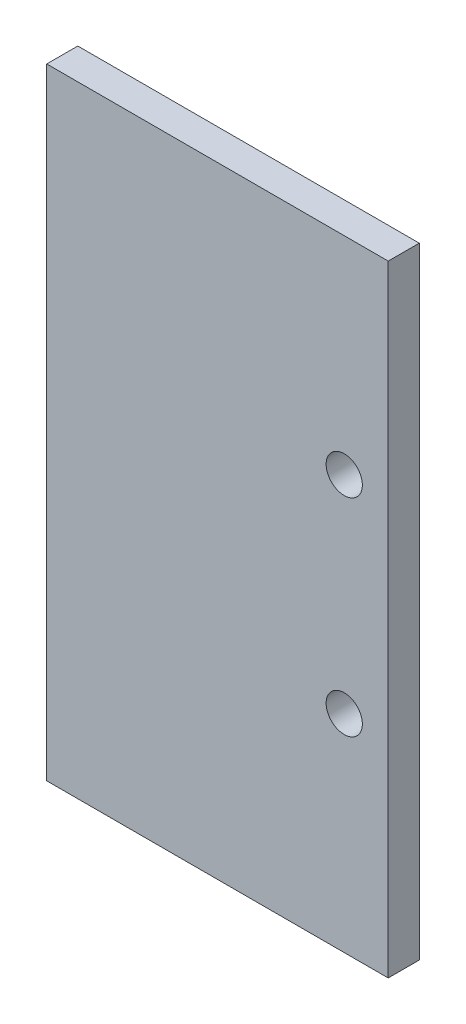
ISO-10303-21;
HEADER;
FILE_DESCRIPTION(('STEP AP214'),'2;1');
FILE_NAME('part.step','',(''),(''),'','','');
FILE_SCHEMA(('AUTOMOTIVE_DESIGN { 1 0 10303 214 1 1 1 1 }'));
ENDSEC;
DATA;
#1=APPLICATION_CONTEXT('core data for automotive mechanical design processes');
#2=APPLICATION_PROTOCOL_DEFINITION('international standard','automotive_design',2000,#1);
#3=PRODUCT_CONTEXT('',#1,'mechanical');
#4=PRODUCT('Part','Part','',(#3));
#5=PRODUCT_RELATED_PRODUCT_CATEGORY('part','',(#4));
#6=PRODUCT_DEFINITION_FORMATION('','',#4);
#7=PRODUCT_DEFINITION_CONTEXT('part definition',#1,'design');
#8=PRODUCT_DEFINITION('design','',#6,#7);
#9=PRODUCT_DEFINITION_SHAPE('','',#8);
#10=(LENGTH_UNIT() NAMED_UNIT(*) SI_UNIT(.MILLI.,.METRE.));
#11=(NAMED_UNIT(*) PLANE_ANGLE_UNIT() SI_UNIT($,.RADIAN.));
#12=(NAMED_UNIT(*) SI_UNIT($,.STERADIAN.) SOLID_ANGLE_UNIT());
#13=UNCERTAINTY_MEASURE_WITH_UNIT(LENGTH_MEASURE(1.E-05),#10,'distance_accuracy_value','');
#14=(GEOMETRIC_REPRESENTATION_CONTEXT(3) GLOBAL_UNCERTAINTY_ASSIGNED_CONTEXT((#13)) GLOBAL_UNIT_ASSIGNED_CONTEXT((#10,
#11,#12)) REPRESENTATION_CONTEXT('',''));
#15=CARTESIAN_POINT('',(0.,0.,0.));
#16=DIRECTION('',(0.,0.,1.));
#17=DIRECTION('',(1.,0.,0.));
#18=AXIS2_PLACEMENT_3D('',#15,#16,#17);
#19=CARTESIAN_POINT('',(0.,0.,3.));
#20=DIRECTION('',(1.,0.,0.));
#21=DIRECTION('',(0.,0.,-1.));
#22=AXIS2_PLACEMENT_3D('',#19,#20,#21);
#23=PLANE('',#22);
#24=DIRECTION('',(0.,-1.,0.));
#25=VECTOR('',#24,1.);
#26=CARTESIAN_POINT('',(0.,0.,0.));
#27=LINE('',#26,#25);
#28=CARTESIAN_POINT('',(0.,60.,0.));
#29=VERTEX_POINT('',#28);
#30=CARTESIAN_POINT('',(0.,53.,0.));
#31=VERTEX_POINT('',#30);
#32=EDGE_CURVE('E94',#29,#31,#27,.T.);
#33=ORIENTED_EDGE('',*,*,#32,.T.);
#34=CARTESIAN_POINT('',(0.,7.,0.));
#35=VERTEX_POINT('',#34);
#36=EDGE_CURVE('E96',#31,#35,#27,.T.);
#37=ORIENTED_EDGE('',*,*,#36,.T.);
#38=CARTESIAN_POINT('',(0.,0.,0.));
#39=VERTEX_POINT('',#38);
#40=EDGE_CURVE('E104',#35,#39,#27,.T.);
#41=ORIENTED_EDGE('',*,*,#40,.T.);
#42=DIRECTION('',(0.,0.,-1.));
#43=VECTOR('',#42,1.);
#44=CARTESIAN_POINT('',(0.,0.,3.));
#45=LINE('',#44,#43);
#46=CARTESIAN_POINT('',(0.,0.,3.));
#47=VERTEX_POINT('',#46);
#48=EDGE_CURVE('E11',#47,#39,#45,.T.);
#49=ORIENTED_EDGE('',*,*,#48,.F.);
#50=DIRECTION('',(0.,-1.,0.));
#51=VECTOR('',#50,1.);
#52=CARTESIAN_POINT('',(0.,0.,3.));
#53=LINE('',#52,#51);
#54=CARTESIAN_POINT('',(0.,60.,3.));
#55=VERTEX_POINT('',#54);
#56=EDGE_CURVE('E122',#55,#47,#53,.T.);
#57=ORIENTED_EDGE('',*,*,#56,.F.);
#58=DIRECTION('',(0.,0.,-1.));
#59=VECTOR('',#58,1.);
#60=CARTESIAN_POINT('',(0.,60.,3.));
#61=LINE('',#60,#59);
#62=EDGE_CURVE('E98',#55,#29,#61,.T.);
#63=ORIENTED_EDGE('',*,*,#62,.T.);
#64=EDGE_LOOP('',(#33,#37,#41,#49,#57,#63));
#65=FACE_BOUND('',#64,.T.);
#66=ADVANCED_FACE('F39',(#65),#23,.F.);
#67=CARTESIAN_POINT('',(0.,0.,3.));
#68=DIRECTION('',(0.,1.,0.));
#69=DIRECTION('',(0.,0.,1.));
#70=AXIS2_PLACEMENT_3D('',#67,#68,#69);
#71=PLANE('',#70);
#72=DIRECTION('',(1.,0.,0.));
#73=VECTOR('',#72,1.);
#74=CARTESIAN_POINT('',(0.,0.,0.));
#75=LINE('',#74,#73);
#76=CARTESIAN_POINT('',(33.,0.,0.));
#77=VERTEX_POINT('',#76);
#78=EDGE_CURVE('E102',#39,#77,#75,.T.);
#79=ORIENTED_EDGE('',*,*,#78,.T.);
#80=DIRECTION('',(0.,0.,-1.));
#81=VECTOR('',#80,1.);
#82=CARTESIAN_POINT('',(33.,0.,3.));
#83=LINE('',#82,#81);
#84=CARTESIAN_POINT('',(33.,0.,3.));
#85=VERTEX_POINT('',#84);
#86=EDGE_CURVE('E47',#85,#77,#83,.T.);
#87=ORIENTED_EDGE('',*,*,#86,.F.);
#88=DIRECTION('',(1.,0.,0.));
#89=VECTOR('',#88,1.);
#90=CARTESIAN_POINT('',(0.,0.,3.));
#91=LINE('',#90,#89);
#92=EDGE_CURVE('E88',#47,#85,#91,.T.);
#93=ORIENTED_EDGE('',*,*,#92,.F.);
#94=ORIENTED_EDGE('',*,*,#48,.T.);
#95=EDGE_LOOP('',(#79,#87,#93,#94));
#96=FACE_BOUND('',#95,.T.);
#97=ADVANCED_FACE('F137',(#96),#71,.F.);
#98=CARTESIAN_POINT('',(33.,0.,3.));
#99=DIRECTION('',(-1.,0.,0.));
#100=DIRECTION('',(0.,0.,1.));
#101=AXIS2_PLACEMENT_3D('',#98,#99,#100);
#102=PLANE('',#101);
#103=DIRECTION('',(0.,1.,0.));
#104=VECTOR('',#103,1.);
#105=CARTESIAN_POINT('',(33.,0.,0.));
#106=LINE('',#105,#104);
#107=CARTESIAN_POINT('',(33.,60.,0.));
#108=VERTEX_POINT('',#107);
#109=EDGE_CURVE('E117',#77,#108,#106,.T.);
#110=ORIENTED_EDGE('',*,*,#109,.T.);
#111=DIRECTION('',(0.,0.,-1.));
#112=VECTOR('',#111,1.);
#113=CARTESIAN_POINT('',(33.,60.,3.));
#114=LINE('',#113,#112);
#115=CARTESIAN_POINT('',(33.,60.,3.));
#116=VERTEX_POINT('',#115);
#117=EDGE_CURVE('E125',#116,#108,#114,.T.);
#118=ORIENTED_EDGE('',*,*,#117,.F.);
#119=DIRECTION('',(0.,1.,0.));
#120=VECTOR('',#119,1.);
#121=CARTESIAN_POINT('',(33.,0.,3.));
#122=LINE('',#121,#120);
#123=EDGE_CURVE('E134',#85,#116,#122,.T.);
#124=ORIENTED_EDGE('',*,*,#123,.F.);
#125=ORIENTED_EDGE('',*,*,#86,.T.);
#126=EDGE_LOOP('',(#110,#118,#124,#125));
#127=FACE_BOUND('',#126,.T.);
#128=ADVANCED_FACE('F132',(#127),#102,.F.);
#129=CARTESIAN_POINT('',(0.,60.,3.));
#130=DIRECTION('',(0.,-1.,0.));
#131=DIRECTION('',(0.,0.,-1.));
#132=AXIS2_PLACEMENT_3D('',#129,#130,#131);
#133=PLANE('',#132);
#134=DIRECTION('',(-1.,0.,0.));
#135=VECTOR('',#134,1.);
#136=CARTESIAN_POINT('',(0.,60.,0.));
#137=LINE('',#136,#135);
#138=EDGE_CURVE('E81',#108,#29,#137,.T.);
#139=ORIENTED_EDGE('',*,*,#138,.T.);
#140=ORIENTED_EDGE('',*,*,#62,.F.);
#141=DIRECTION('',(-1.,0.,0.));
#142=VECTOR('',#141,1.);
#143=CARTESIAN_POINT('',(0.,60.,3.));
#144=LINE('',#143,#142);
#145=EDGE_CURVE('E60',#116,#55,#144,.T.);
#146=ORIENTED_EDGE('',*,*,#145,.F.);
#147=ORIENTED_EDGE('',*,*,#117,.T.);
#148=EDGE_LOOP('',(#139,#140,#146,#147));
#149=FACE_BOUND('',#148,.T.);
#150=ADVANCED_FACE('F147',(#149),#133,.F.);
#151=CARTESIAN_POINT('',(0.,0.,3.));
#152=DIRECTION('',(0.,0.,-1.));
#153=DIRECTION('',(-1.,0.,0.));
#154=AXIS2_PLACEMENT_3D('',#151,#152,#153);
#155=PLANE('',#154);
#156=CARTESIAN_POINT('',(28.75,40.,3.));
#157=DIRECTION('',(0.,0.,-1.));
#158=DIRECTION('',(-1.,0.,0.));
#159=AXIS2_PLACEMENT_3D('',#156,#157,#158);
#160=CIRCLE('',#159,1.75);
#161=CARTESIAN_POINT('',(27.,40.,3.));
#162=VERTEX_POINT('',#161);
#163=EDGE_CURVE('E257',#162,#162,#160,.T.);
#164=ORIENTED_EDGE('',*,*,#163,.T.);
#165=EDGE_LOOP('',(#164));
#166=FACE_BOUND('',#165,.T.);
#167=CARTESIAN_POINT('',(28.75,20.,3.));
#168=DIRECTION('',(0.,0.,-1.));
#169=DIRECTION('',(-1.,0.,0.));
#170=AXIS2_PLACEMENT_3D('',#167,#168,#169);
#171=CIRCLE('',#170,1.75);
#172=CARTESIAN_POINT('',(27.,20.,3.));
#173=VERTEX_POINT('',#172);
#174=EDGE_CURVE('E262',#173,#173,#171,.T.);
#175=ORIENTED_EDGE('',*,*,#174,.T.);
#176=EDGE_LOOP('',(#175));
#177=FACE_BOUND('',#176,.T.);
#178=ORIENTED_EDGE('',*,*,#56,.T.);
#179=ORIENTED_EDGE('',*,*,#92,.T.);
#180=ORIENTED_EDGE('',*,*,#123,.T.);
#181=ORIENTED_EDGE('',*,*,#145,.T.);
#182=EDGE_LOOP('',(#178,#179,#180,#181));
#183=FACE_BOUND('',#182,.T.);
#184=ADVANCED_FACE('F146',(#166,#177,#183),#155,.F.);
#185=CARTESIAN_POINT('',(0.,0.,0.));
#186=DIRECTION('',(0.,0.,-1.));
#187=DIRECTION('',(-1.,0.,0.));
#188=AXIS2_PLACEMENT_3D('',#185,#186,#187);
#189=PLANE('',#188);
#190=CARTESIAN_POINT('',(28.75,40.,0.));
#191=DIRECTION('',(0.,0.,-1.));
#192=DIRECTION('',(-1.,0.,0.));
#193=AXIS2_PLACEMENT_3D('',#190,#191,#192);
#194=CIRCLE('',#193,1.75);
#195=CARTESIAN_POINT('',(27.,40.,0.));
#196=VERTEX_POINT('',#195);
#197=EDGE_CURVE('E260',#196,#196,#194,.T.);
#198=ORIENTED_EDGE('',*,*,#197,.F.);
#199=EDGE_LOOP('',(#198));
#200=FACE_BOUND('',#199,.T.);
#201=CARTESIAN_POINT('',(28.75,20.,0.));
#202=DIRECTION('',(0.,0.,-1.));
#203=DIRECTION('',(-1.,0.,0.));
#204=AXIS2_PLACEMENT_3D('',#201,#202,#203);
#205=CIRCLE('',#204,1.75);
#206=CARTESIAN_POINT('',(27.,20.,0.));
#207=VERTEX_POINT('',#206);
#208=EDGE_CURVE('E268',#207,#207,#205,.T.);
#209=ORIENTED_EDGE('',*,*,#208,.F.);
#210=EDGE_LOOP('',(#209));
#211=FACE_BOUND('',#210,.T.);
#212=ORIENTED_EDGE('',*,*,#40,.F.);
#213=CARTESIAN_POINT('',(3.75,7.,0.));
#214=DIRECTION('',(0.,0.,-1.));
#215=DIRECTION('',(-1.,0.,0.));
#216=AXIS2_PLACEMENT_3D('',#213,#214,#215);
#217=CIRCLE('',#216,3.75);
#218=EDGE_CURVE('E52',#35,#35,#217,.T.);
#219=ORIENTED_EDGE('',*,*,#218,.F.);
#220=ORIENTED_EDGE('',*,*,#36,.F.);
#221=CARTESIAN_POINT('',(3.75,53.,0.));
#222=DIRECTION('',(0.,0.,-1.));
#223=DIRECTION('',(-1.,0.,0.));
#224=AXIS2_PLACEMENT_3D('',#221,#222,#223);
#225=CIRCLE('',#224,3.75);
#226=EDGE_CURVE('E108',#31,#31,#225,.T.);
#227=ORIENTED_EDGE('',*,*,#226,.F.);
#228=ORIENTED_EDGE('',*,*,#32,.F.);
#229=ORIENTED_EDGE('',*,*,#138,.F.);
#230=ORIENTED_EDGE('',*,*,#109,.F.);
#231=ORIENTED_EDGE('',*,*,#78,.F.);
#232=EDGE_LOOP('',(#212,#219,#220,#227,#228,#229,#230,#231));
#233=FACE_BOUND('',#232,.T.);
#234=ADVANCED_FACE('F106',(#200,#211,#233),#189,.T.);
#235=CARTESIAN_POINT('',(3.75,53.,-1.2));
#236=DIRECTION('',(0.,0.,1.));
#237=DIRECTION('',(1.,0.,0.));
#238=AXIS2_PLACEMENT_3D('',#235,#236,#237);
#239=CYLINDRICAL_SURFACE('',#238,3.75);
#240=CARTESIAN_POINT('',(3.75,53.,-1.2));
#241=DIRECTION('',(0.,0.,-1.));
#242=DIRECTION('',(-1.,0.,0.));
#243=AXIS2_PLACEMENT_3D('',#240,#241,#242);
#244=CIRCLE('',#243,3.75);
#245=CARTESIAN_POINT('',(0.,53.,-1.2));
#246=VERTEX_POINT('',#245);
#247=EDGE_CURVE('E111',#246,#246,#244,.T.);
#248=ORIENTED_EDGE('',*,*,#247,.F.);
#249=EDGE_LOOP('',(#248));
#250=FACE_BOUND('',#249,.T.);
#251=ORIENTED_EDGE('',*,*,#226,.T.);
#252=EDGE_LOOP('',(#251));
#253=FACE_BOUND('',#252,.T.);
#254=ADVANCED_FACE('F182',(#250,#253),#239,.T.);
#255=CARTESIAN_POINT('',(3.75,53.,-1.2));
#256=DIRECTION('',(0.,0.,-1.));
#257=DIRECTION('',(-1.,0.,0.));
#258=AXIS2_PLACEMENT_3D('',#255,#256,#257);
#259=PLANE('',#258);
#260=ORIENTED_EDGE('',*,*,#247,.T.);
#261=EDGE_LOOP('',(#260));
#262=FACE_BOUND('',#261,.T.);
#263=ADVANCED_FACE('F187',(#262),#259,.T.);
#264=CARTESIAN_POINT('',(3.75,7.,-1.2));
#265=DIRECTION('',(0.,0.,1.));
#266=DIRECTION('',(1.,0.,0.));
#267=AXIS2_PLACEMENT_3D('',#264,#265,#266);
#268=CYLINDRICAL_SURFACE('',#267,3.75);
#269=CARTESIAN_POINT('',(3.75,7.,-1.2));
#270=DIRECTION('',(0.,0.,-1.));
#271=DIRECTION('',(-1.,0.,0.));
#272=AXIS2_PLACEMENT_3D('',#269,#270,#271);
#273=CIRCLE('',#272,3.75);
#274=CARTESIAN_POINT('',(0.,7.,-1.2));
#275=VERTEX_POINT('',#274);
#276=EDGE_CURVE('E274',#275,#275,#273,.T.);
#277=ORIENTED_EDGE('',*,*,#276,.F.);
#278=EDGE_LOOP('',(#277));
#279=FACE_BOUND('',#278,.T.);
#280=ORIENTED_EDGE('',*,*,#218,.T.);
#281=EDGE_LOOP('',(#280));
#282=FACE_BOUND('',#281,.T.);
#283=ADVANCED_FACE('F199',(#279,#282),#268,.T.);
#284=CARTESIAN_POINT('',(3.75,7.,-1.2));
#285=DIRECTION('',(0.,0.,-1.));
#286=DIRECTION('',(-1.,0.,0.));
#287=AXIS2_PLACEMENT_3D('',#284,#285,#286);
#288=PLANE('',#287);
#289=ORIENTED_EDGE('',*,*,#276,.T.);
#290=EDGE_LOOP('',(#289));
#291=FACE_BOUND('',#290,.T.);
#292=ADVANCED_FACE('F209',(#291),#288,.T.);
#293=CARTESIAN_POINT('',(28.75,20.,3.));
#294=DIRECTION('',(0.,0.,-1.));
#295=DIRECTION('',(-1.,0.,0.));
#296=AXIS2_PLACEMENT_3D('',#293,#294,#295);
#297=CYLINDRICAL_SURFACE('',#296,1.75);
#298=ORIENTED_EDGE('',*,*,#174,.F.);
#299=EDGE_LOOP('',(#298));
#300=FACE_BOUND('',#299,.T.);
#301=ORIENTED_EDGE('',*,*,#208,.T.);
#302=EDGE_LOOP('',(#301));
#303=FACE_BOUND('',#302,.T.);
#304=ADVANCED_FACE('F219',(#300,#303),#297,.F.);
#305=CARTESIAN_POINT('',(28.75,40.,3.));
#306=DIRECTION('',(0.,0.,-1.));
#307=DIRECTION('',(-1.,0.,0.));
#308=AXIS2_PLACEMENT_3D('',#305,#306,#307);
#309=CYLINDRICAL_SURFACE('',#308,1.75);
#310=ORIENTED_EDGE('',*,*,#163,.F.);
#311=EDGE_LOOP('',(#310));
#312=FACE_BOUND('',#311,.T.);
#313=ORIENTED_EDGE('',*,*,#197,.T.);
#314=EDGE_LOOP('',(#313));
#315=FACE_BOUND('',#314,.T.);
#316=ADVANCED_FACE('F240',(#312,#315),#309,.F.);
#317=CLOSED_SHELL('',(#66,#97,#128,#150,#184,#234,#254,#263,#283,#292,#304,#316));
#318=MANIFOLD_SOLID_BREP('B2',#317);
#319=ADVANCED_BREP_SHAPE_REPRESENTATION('',(#18,#318),#14);
#320=SHAPE_DEFINITION_REPRESENTATION(#9,#319);
ENDSEC;
END-ISO-10303-21;
